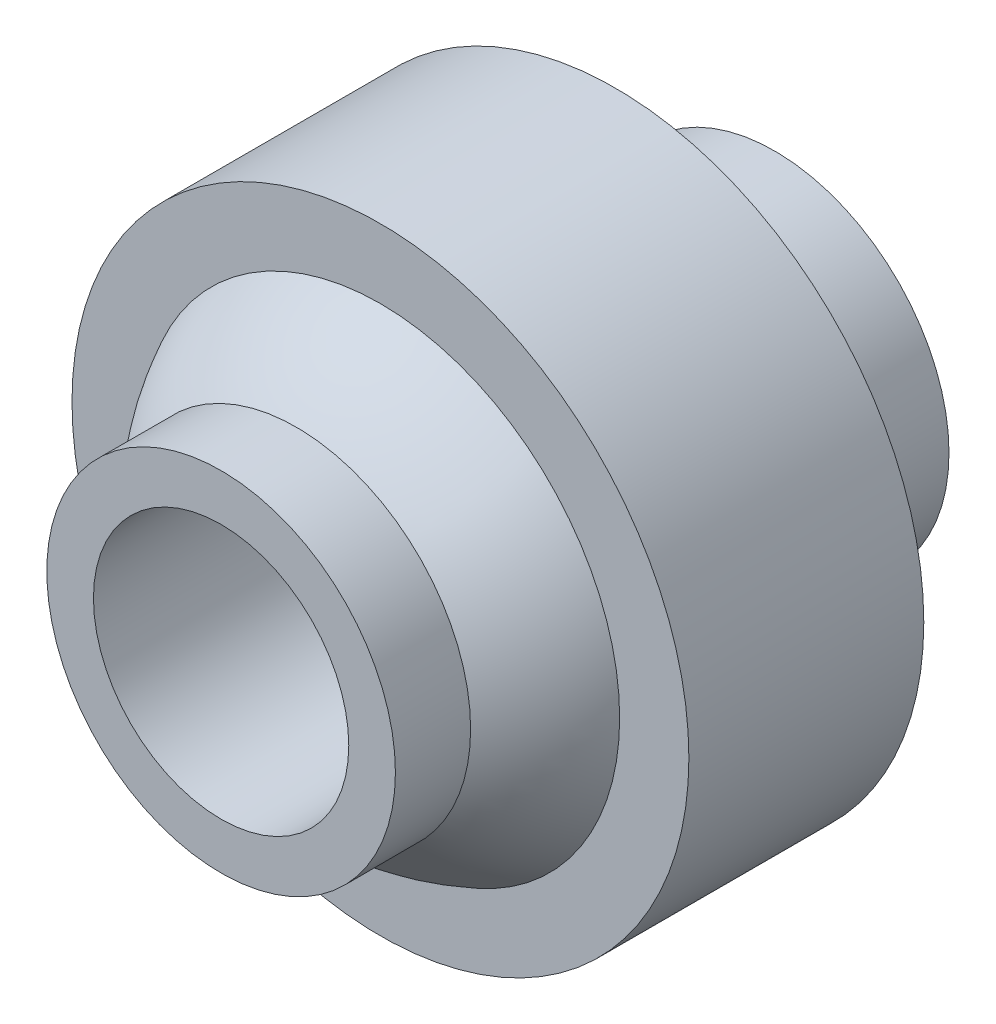
ISO-10303-21;
HEADER;
FILE_DESCRIPTION(('STEP AP214'),'2;1');
FILE_NAME('part.step','',(''),(''),'','','');
FILE_SCHEMA(('AUTOMOTIVE_DESIGN { 1 0 10303 214 1 1 1 1 }'));
ENDSEC;
DATA;
#1=APPLICATION_CONTEXT('core data for automotive mechanical design processes');
#2=APPLICATION_PROTOCOL_DEFINITION('international standard','automotive_design',2000,#1);
#3=PRODUCT_CONTEXT('',#1,'mechanical');
#4=PRODUCT('Part','Part','',(#3));
#5=PRODUCT_RELATED_PRODUCT_CATEGORY('part','',(#4));
#6=PRODUCT_DEFINITION_FORMATION('','',#4);
#7=PRODUCT_DEFINITION_CONTEXT('part definition',#1,'design');
#8=PRODUCT_DEFINITION('design','',#6,#7);
#9=PRODUCT_DEFINITION_SHAPE('','',#8);
#10=(LENGTH_UNIT() NAMED_UNIT(*) SI_UNIT(.MILLI.,.METRE.));
#11=(NAMED_UNIT(*) PLANE_ANGLE_UNIT() SI_UNIT($,.RADIAN.));
#12=(NAMED_UNIT(*) SI_UNIT($,.STERADIAN.) SOLID_ANGLE_UNIT());
#13=UNCERTAINTY_MEASURE_WITH_UNIT(LENGTH_MEASURE(1.E-05),#10,'distance_accuracy_value','');
#14=(GEOMETRIC_REPRESENTATION_CONTEXT(3) GLOBAL_UNCERTAINTY_ASSIGNED_CONTEXT((#13)) GLOBAL_UNIT_ASSIGNED_CONTEXT((#10,
#11,#12)) REPRESENTATION_CONTEXT('',''));
#15=CARTESIAN_POINT('',(0.,0.,0.));
#16=DIRECTION('',(0.,0.,1.));
#17=DIRECTION('',(1.,0.,0.));
#18=AXIS2_PLACEMENT_3D('',#15,#16,#17);
#19=CARTESIAN_POINT('',(0.,-4.7625,10.3251));
#20=DIRECTION('',(0.,0.,1.));
#21=DIRECTION('',(1.,0.,0.));
#22=AXIS2_PLACEMENT_3D('',#19,#20,#21);
#23=PLANE('',#22);
#24=CARTESIAN_POINT('',(0.,0.,10.3251));
#25=DIRECTION('',(0.,0.,1.));
#26=DIRECTION('',(1.,0.,0.));
#27=AXIS2_PLACEMENT_3D('',#24,#25,#26);
#28=CIRCLE('',#27,6.5024);
#29=CARTESIAN_POINT('',(6.5024,0.,10.3251));
#30=VERTEX_POINT('',#29);
#31=EDGE_CURVE('E11',#30,#30,#28,.T.);
#32=ORIENTED_EDGE('',*,*,#31,.T.);
#33=EDGE_LOOP('',(#32));
#34=FACE_BOUND('',#33,.T.);
#35=CARTESIAN_POINT('',(0.,0.,10.3251));
#36=DIRECTION('',(0.,0.,1.));
#37=DIRECTION('',(1.,0.,0.));
#38=AXIS2_PLACEMENT_3D('',#35,#36,#37);
#39=CIRCLE('',#38,4.7625);
#40=CARTESIAN_POINT('',(4.7625,0.,10.3251));
#41=VERTEX_POINT('',#40);
#42=EDGE_CURVE('E95',#41,#41,#39,.T.);
#43=ORIENTED_EDGE('',*,*,#42,.F.);
#44=EDGE_LOOP('',(#43));
#45=FACE_BOUND('',#44,.T.);
#46=ADVANCED_FACE('F46',(#34,#45),#23,.T.);
#47=CARTESIAN_POINT('',(0.,0.,0.));
#48=DIRECTION('',(0.,0.,1.));
#49=DIRECTION('',(1.,0.,0.));
#50=AXIS2_PLACEMENT_3D('',#47,#48,#49);
#51=CYLINDRICAL_SURFACE('',#50,6.5024);
#52=CARTESIAN_POINT('',(0.,0.,7.51999303852258));
#53=DIRECTION('',(0.,0.,1.));
#54=DIRECTION('',(1.,0.,0.));
#55=AXIS2_PLACEMENT_3D('',#52,#53,#54);
#56=CIRCLE('',#55,6.5024);
#57=CARTESIAN_POINT('',(0.,-6.5024,7.51999303852258));
#58=VERTEX_POINT('',#57);
#59=EDGE_CURVE('E54',#58,#58,#56,.T.);
#60=ORIENTED_EDGE('',*,*,#59,.T.);
#61=EDGE_LOOP('',(#60));
#62=FACE_BOUND('',#61,.T.);
#63=ORIENTED_EDGE('',*,*,#31,.F.);
#64=EDGE_LOOP('',(#63));
#65=FACE_BOUND('',#64,.T.);
#66=ADVANCED_FACE('F103',(#62,#65),#51,.T.);
#67=CARTESIAN_POINT('',(0.,0.,0.));
#68=DIRECTION('',(0.,0.,1.));
#69=DIRECTION('',(0.,-1.,0.));
#70=AXIS2_PLACEMENT_3D('',#67,#68,#69);
#71=SPHERICAL_SURFACE('',#70,9.94140337474685);
#72=CARTESIAN_POINT('',(0.,0.,4.3815));
#73=DIRECTION('',(0.,0.,1.));
#74=DIRECTION('',(1.,0.,0.));
#75=AXIS2_PLACEMENT_3D('',#72,#73,#74);
#76=CIRCLE('',#75,8.92378612526253);
#77=CARTESIAN_POINT('',(0.,-8.92378612526253,4.3815));
#78=VERTEX_POINT('',#77);
#79=EDGE_CURVE('E60',#78,#78,#76,.T.);
#80=CARTESIAN_POINT('',(0.,-8.92378612526253,4.3815));
#81=CARTESIAN_POINT('',(0.,-8.90546481729422,4.41881497896161));
#82=CARTESIAN_POINT('',(0.,-8.88690943364751,4.45601502848034));
#83=CARTESIAN_POINT('',(0.,-8.8493334926746,4.5301794439424));
#84=CARTESIAN_POINT('',(0.,-8.83031293534842,4.56714380988573));
#85=CARTESIAN_POINT('',(0.,-8.79180962469392,4.64083103350731));
#86=CARTESIAN_POINT('',(0.,-8.77232687136561,4.67755389118557));
#87=CARTESIAN_POINT('',(0.,-8.73290223873137,4.75075232152972));
#88=CARTESIAN_POINT('',(0.,-8.71296035942545,4.78722789419562));
#89=CARTESIAN_POINT('',(0.,-8.67262061185469,4.85992601401866));
#90=CARTESIAN_POINT('',(0.,-8.65222274358986,4.8961485611758));
#91=CARTESIAN_POINT('',(0.,-8.61097422828435,4.96833493001549));
#92=CARTESIAN_POINT('',(0.,-8.59012358124367,5.00429875169802));
#93=CARTESIAN_POINT('',(0.,-8.54797278944319,5.07596201014548));
#94=CARTESIAN_POINT('',(0.,-8.52667264468339,5.1116614469104));
#95=CARTESIAN_POINT('',(0.,-8.48362620933714,5.18279031773544));
#96=CARTESIAN_POINT('',(0.,-8.46187991875069,5.21821975179556));
#97=CARTESIAN_POINT('',(0.,-8.41794461382371,5.28880304189874));
#98=CARTESIAN_POINT('',(0.,-8.39575559948319,5.3239568979418));
#99=CARTESIAN_POINT('',(0.,-8.35093833879657,5.39398350006827));
#100=CARTESIAN_POINT('',(0.,-8.32831009245048,5.42885624615169));
#101=CARTESIAN_POINT('',(0.,-8.28261792861852,5.49831514065181));
#102=CARTESIAN_POINT('',(0.,-8.25955401113264,5.53290128906852));
#103=CARTESIAN_POINT('',(0.,-8.21299413444624,5.60178154562856));
#104=CARTESIAN_POINT('',(0.,-8.18949817524573,5.63607565377188));
#105=CARTESIAN_POINT('',(0.,-8.14207791254278,5.70436643313491));
#106=CARTESIAN_POINT('',(0.,-8.11815360904034,5.73836310435463));
#107=CARTESIAN_POINT('',(0.,-8.06988042255219,5.80605366002607));
#108=CARTESIAN_POINT('',(0.,-8.04553153956648,5.83974754447779));
#109=CARTESIAN_POINT('',(0.,-7.99641302574381,5.9068272244165));
#110=CARTESIAN_POINT('',(0.,-7.97164339490686,5.9402130199035));
#111=CARTESIAN_POINT('',(0.,-7.92168728322426,6.00667126819807));
#112=CARTESIAN_POINT('',(0.,-7.89650080237861,6.03974372100565));
#113=CARTESIAN_POINT('',(0.,-7.84571495411821,6.1055700795355));
#114=CARTESIAN_POINT('',(0.,-7.82011558670347,6.13832398525776));
#115=CARTESIAN_POINT('',(0.,-7.76850799371789,6.20350809533884));
#116=CARTESIAN_POINT('',(0.,-7.74249976814705,6.23593829969766));
#117=CARTESIAN_POINT('',(0.,-7.69007855160175,6.30046990371258));
#118=CARTESIAN_POINT('',(0.,-7.66366556062728,6.33257130336868));
#119=CARTESIAN_POINT('',(0.,-7.6104389697226,6.39644024638086));
#120=CARTESIAN_POINT('',(0.,-7.58362536979238,6.42820778973694));
#121=CARTESIAN_POINT('',(0.,-7.52960178046539,6.49140402108863));
#122=CARTESIAN_POINT('',(0.,-7.50239179106862,6.52283270908424));
#123=CARTESIAN_POINT('',(0.,-7.4475797046751,6.58534628397816));
#124=CARTESIAN_POINT('',(0.,-7.41997760767835,6.61643117087646));
#125=CARTESIAN_POINT('',(0.,-7.36438564965487,6.67825225194063));
#126=CARTESIAN_POINT('',(0.,-7.33639578862814,6.7089884461065));
#127=CARTESIAN_POINT('',(0.,-7.2800327071351,6.7701073049427));
#128=CARTESIAN_POINT('',(0.,-7.25165948666879,6.80048996961304));
#129=CARTESIAN_POINT('',(0.,-7.19453415121242,6.86089698832622));
#130=CARTESIAN_POINT('',(0.,-7.16578203622236,6.89092134236905));
#131=CARTESIAN_POINT('',(0.,-7.10790343626401,6.95060701508642));
#132=CARTESIAN_POINT('',(0.,-7.07877695129571,6.98026833376096));
#133=CARTESIAN_POINT('',(0.,-7.02015419481851,7.03922326810686));
#134=CARTESIAN_POINT('',(0.,-6.99065792330961,7.06851688377822));
#135=CARTESIAN_POINT('',(0.,-6.93130023545503,7.12673180243079));
#136=CARTESIAN_POINT('',(0.,-6.90143881910936,7.15565310541201));
#137=CARTESIAN_POINT('',(0.,-6.84135554046498,7.21311884726939));
#138=CARTESIAN_POINT('',(0.,-6.81113367816628,7.24166328614556));
#139=CARTESIAN_POINT('',(0.,-6.75033426426818,7.29837080886381));
#140=CARTESIAN_POINT('',(0.,-6.71975671266878,7.32653389270588));
#141=CARTESIAN_POINT('',(0.,-6.65825072888505,7.3824742700304));
#142=CARTESIAN_POINT('',(0.,-6.62732229670071,7.41025156351284));
#143=CARTESIAN_POINT('',(0.,-6.56511943026807,7.46541600195276));
#144=CARTESIAN_POINT('',(0.,-6.53384499601978,7.49280314691024));
#145=CARTESIAN_POINT('',(0.,-6.5024,7.51999303852258));
#146=B_SPLINE_CURVE_WITH_KNOTS('',3,(#80,#81,#82,#83,#84,#85,#86,#87,#88,#89,#90,#91,#92,#93,
#94,#95,#96,#97,#98,#99,#100,#101,#102,#103,#104,#105,#106,#107,#108,#109,#110,#111,#112,#113,
#114,#115,#116,#117,#118,#119,#120,#121,#122,#123,#124,#125,#126,#127,#128,#129,#130,#131,#132,
#133,#134,#135,#136,#137,#138,#139,#140,#141,#142,#143,#144,#145),.UNSPECIFIED.,.F.,.F.,(4,2,2,
2,2,2,2,2,2,2,2,2,2,2,2,2,2,2,2,2,2,2,2,2,2,2,2,2,2,2,2,2,4),(0.,0.124709653743759,
0.249419307487516,0.374128961231273,0.49883861497503,0.623548268718787,0.748257922462545,
0.872967576206303,0.997677229950059,1.12238688369382,1.24709653743757,1.37180619118133,
1.49651584492509,1.62122549866885,1.7459351524126,1.87064480615636,1.99535445990012,
2.12006411364388,2.24477376738763,2.36948342113139,2.49419307487515,2.6189027286189,
2.74361238236266,2.86832203610642,2.99303168985018,3.11774134359393,3.24245099733769,
3.36716065108145,3.49187030482521,3.61657995856896,3.74128961231272,3.86599926605648,
3.99070891980024),.UNSPECIFIED.);
#147=EDGE_CURVE('BSEAM107',#78,#58,#146,.T.);
#148=ORIENTED_EDGE('',*,*,#79,.T.);
#149=ORIENTED_EDGE('',*,*,#59,.F.);
#150=ORIENTED_EDGE('',*,*,#147,.T.);
#151=ORIENTED_EDGE('',*,*,#147,.F.);
#152=EDGE_LOOP('',(#148,#150,#149,#151));
#153=FACE_BOUND('',#152,.T.);
#154=ADVANCED_FACE('F107',(#153),#71,.T.);
#155=CARTESIAN_POINT('',(0.,-8.92378612526253,4.3815));
#156=DIRECTION('',(0.,0.,1.));
#157=DIRECTION('',(1.,0.,0.));
#158=AXIS2_PLACEMENT_3D('',#155,#156,#157);
#159=PLANE('',#158);
#160=CARTESIAN_POINT('',(0.,0.,4.3815));
#161=DIRECTION('',(0.,0.,1.));
#162=DIRECTION('',(1.,0.,0.));
#163=AXIS2_PLACEMENT_3D('',#160,#161,#162);
#164=CIRCLE('',#163,11.5062);
#165=CARTESIAN_POINT('',(11.5062,0.,4.3815));
#166=VERTEX_POINT('',#165);
#167=EDGE_CURVE('E65',#166,#166,#164,.T.);
#168=ORIENTED_EDGE('',*,*,#167,.T.);
#169=EDGE_LOOP('',(#168));
#170=FACE_BOUND('',#169,.T.);
#171=ORIENTED_EDGE('',*,*,#79,.F.);
#172=EDGE_LOOP('',(#171));
#173=FACE_BOUND('',#172,.T.);
#174=ADVANCED_FACE('F111',(#170,#173),#159,.T.);
#175=CARTESIAN_POINT('',(0.,0.,0.));
#176=DIRECTION('',(0.,0.,1.));
#177=DIRECTION('',(1.,0.,0.));
#178=AXIS2_PLACEMENT_3D('',#175,#176,#177);
#179=CYLINDRICAL_SURFACE('',#178,11.5062);
#180=CARTESIAN_POINT('',(0.,0.,-4.3815));
#181=DIRECTION('',(0.,0.,1.));
#182=DIRECTION('',(1.,0.,0.));
#183=AXIS2_PLACEMENT_3D('',#180,#181,#182);
#184=CIRCLE('',#183,11.5062);
#185=CARTESIAN_POINT('',(11.5062,0.,-4.3815));
#186=VERTEX_POINT('',#185);
#187=EDGE_CURVE('E76',#186,#186,#184,.T.);
#188=ORIENTED_EDGE('',*,*,#187,.T.);
#189=EDGE_LOOP('',(#188));
#190=FACE_BOUND('',#189,.T.);
#191=ORIENTED_EDGE('',*,*,#167,.F.);
#192=EDGE_LOOP('',(#191));
#193=FACE_BOUND('',#192,.T.);
#194=ADVANCED_FACE('F118',(#190,#193),#179,.T.);
#195=CARTESIAN_POINT('',(0.,-11.5062,-4.3815));
#196=DIRECTION('',(0.,0.,-1.));
#197=DIRECTION('',(-1.,0.,0.));
#198=AXIS2_PLACEMENT_3D('',#195,#196,#197);
#199=PLANE('',#198);
#200=CARTESIAN_POINT('',(0.,0.,-4.3815));
#201=DIRECTION('',(0.,0.,1.));
#202=DIRECTION('',(1.,0.,0.));
#203=AXIS2_PLACEMENT_3D('',#200,#201,#202);
#204=CIRCLE('',#203,8.92378612526253);
#205=CARTESIAN_POINT('',(0.,-8.92378612526253,-4.3815));
#206=VERTEX_POINT('',#205);
#207=EDGE_CURVE('E80',#206,#206,#204,.T.);
#208=ORIENTED_EDGE('',*,*,#207,.T.);
#209=EDGE_LOOP('',(#208));
#210=FACE_BOUND('',#209,.T.);
#211=ORIENTED_EDGE('',*,*,#187,.F.);
#212=EDGE_LOOP('',(#211));
#213=FACE_BOUND('',#212,.T.);
#214=ADVANCED_FACE('F122',(#210,#213),#199,.T.);
#215=CARTESIAN_POINT('',(0.,0.,0.));
#216=DIRECTION('',(0.,0.,1.));
#217=DIRECTION('',(0.,-1.,0.));
#218=AXIS2_PLACEMENT_3D('',#215,#216,#217);
#219=SPHERICAL_SURFACE('',#218,9.94140337474685);
#220=CARTESIAN_POINT('',(0.,0.,-7.51999303852258));
#221=DIRECTION('',(0.,0.,1.));
#222=DIRECTION('',(1.,0.,0.));
#223=AXIS2_PLACEMENT_3D('',#220,#221,#222);
#224=CIRCLE('',#223,6.5024);
#225=CARTESIAN_POINT('',(0.,-6.5024,-7.51999303852258));
#226=VERTEX_POINT('',#225);
#227=EDGE_CURVE('E85',#226,#226,#224,.T.);
#228=CARTESIAN_POINT('',(0.,-6.5024,-7.51999303852258));
#229=CARTESIAN_POINT('',(0.,-6.53384499601978,-7.49280314691024));
#230=CARTESIAN_POINT('',(0.,-6.56511943026807,-7.46541600195276));
#231=CARTESIAN_POINT('',(0.,-6.62732229670071,-7.41025156351284));
#232=CARTESIAN_POINT('',(0.,-6.65825072888505,-7.3824742700304));
#233=CARTESIAN_POINT('',(0.,-6.71975671266878,-7.32653389270588));
#234=CARTESIAN_POINT('',(0.,-6.75033426426818,-7.29837080886381));
#235=CARTESIAN_POINT('',(0.,-6.81113367816628,-7.24166328614556));
#236=CARTESIAN_POINT('',(0.,-6.84135554046498,-7.21311884726939));
#237=CARTESIAN_POINT('',(0.,-6.90143881910936,-7.15565310541201));
#238=CARTESIAN_POINT('',(0.,-6.93130023545503,-7.12673180243079));
#239=CARTESIAN_POINT('',(0.,-6.99065792330961,-7.06851688377822));
#240=CARTESIAN_POINT('',(0.,-7.02015419481851,-7.03922326810686));
#241=CARTESIAN_POINT('',(0.,-7.07877695129571,-6.98026833376096));
#242=CARTESIAN_POINT('',(0.,-7.10790343626401,-6.95060701508642));
#243=CARTESIAN_POINT('',(0.,-7.16578203622236,-6.89092134236905));
#244=CARTESIAN_POINT('',(0.,-7.19453415121242,-6.86089698832622));
#245=CARTESIAN_POINT('',(0.,-7.25165948666878,-6.80048996961304));
#246=CARTESIAN_POINT('',(0.,-7.2800327071351,-6.7701073049427));
#247=CARTESIAN_POINT('',(0.,-7.33639578862814,-6.7089884461065));
#248=CARTESIAN_POINT('',(0.,-7.36438564965487,-6.67825225194063));
#249=CARTESIAN_POINT('',(0.,-7.41997760767835,-6.61643117087646));
#250=CARTESIAN_POINT('',(0.,-7.4475797046751,-6.58534628397816));
#251=CARTESIAN_POINT('',(0.,-7.50239179106862,-6.52283270908424));
#252=CARTESIAN_POINT('',(0.,-7.52960178046539,-6.49140402108863));
#253=CARTESIAN_POINT('',(0.,-7.58362536979238,-6.42820778973694));
#254=CARTESIAN_POINT('',(0.,-7.6104389697226,-6.39644024638086));
#255=CARTESIAN_POINT('',(0.,-7.66366556062728,-6.33257130336868));
#256=CARTESIAN_POINT('',(0.,-7.69007855160175,-6.30046990371258));
#257=CARTESIAN_POINT('',(0.,-7.74249976814705,-6.23593829969766));
#258=CARTESIAN_POINT('',(0.,-7.76850799371789,-6.20350809533884));
#259=CARTESIAN_POINT('',(0.,-7.82011558670347,-6.13832398525776));
#260=CARTESIAN_POINT('',(0.,-7.84571495411821,-6.1055700795355));
#261=CARTESIAN_POINT('',(0.,-7.89650080237861,-6.03974372100565));
#262=CARTESIAN_POINT('',(0.,-7.92168728322426,-6.00667126819808));
#263=CARTESIAN_POINT('',(0.,-7.97164339490686,-5.9402130199035));
#264=CARTESIAN_POINT('',(0.,-7.99641302574381,-5.9068272244165));
#265=CARTESIAN_POINT('',(0.,-8.04553153956647,-5.83974754447779));
#266=CARTESIAN_POINT('',(0.,-8.06988042255219,-5.80605366002607));
#267=CARTESIAN_POINT('',(0.,-8.11815360904034,-5.73836310435463));
#268=CARTESIAN_POINT('',(0.,-8.14207791254278,-5.70436643313492));
#269=CARTESIAN_POINT('',(0.,-8.18949817524573,-5.63607565377188));
#270=CARTESIAN_POINT('',(0.,-8.21299413444624,-5.60178154562856));
#271=CARTESIAN_POINT('',(0.,-8.25955401113264,-5.53290128906853));
#272=CARTESIAN_POINT('',(0.,-8.28261792861851,-5.49831514065181));
#273=CARTESIAN_POINT('',(0.,-8.32831009245048,-5.42885624615169));
#274=CARTESIAN_POINT('',(0.,-8.35093833879657,-5.39398350006827));
#275=CARTESIAN_POINT('',(0.,-8.39575559948318,-5.3239568979418));
#276=CARTESIAN_POINT('',(0.,-8.41794461382371,-5.28880304189874));
#277=CARTESIAN_POINT('',(0.,-8.46187991875069,-5.21821975179556));
#278=CARTESIAN_POINT('',(0.,-8.48362620933714,-5.18279031773544));
#279=CARTESIAN_POINT('',(0.,-8.52667264468339,-5.1116614469104));
#280=CARTESIAN_POINT('',(0.,-8.54797278944319,-5.07596201014548));
#281=CARTESIAN_POINT('',(0.,-8.59012358124367,-5.00429875169803));
#282=CARTESIAN_POINT('',(0.,-8.61097422828434,-4.96833493001549));
#283=CARTESIAN_POINT('',(0.,-8.65222274358986,-4.89614856117581));
#284=CARTESIAN_POINT('',(0.,-8.67262061185469,-4.85992601401867));
#285=CARTESIAN_POINT('',(0.,-8.71296035942545,-4.78722789419562));
#286=CARTESIAN_POINT('',(0.,-8.73290223873136,-4.75075232152973));
#287=CARTESIAN_POINT('',(0.,-8.7723268713656,-4.67755389118557));
#288=CARTESIAN_POINT('',(0.,-8.79180962469392,-4.64083103350731));
#289=CARTESIAN_POINT('',(0.,-8.83031293534842,-4.56714380988573));
#290=CARTESIAN_POINT('',(0.,-8.84933349267461,-4.5301794439424));
#291=CARTESIAN_POINT('',(0.,-8.8869094336475,-4.45601502848034));
#292=CARTESIAN_POINT('',(0.,-8.90546481729422,-4.41881497896161));
#293=CARTESIAN_POINT('',(0.,-8.92378612526253,-4.3815));
#294=B_SPLINE_CURVE_WITH_KNOTS('',3,(#228,#229,#230,#231,#232,#233,#234,#235,#236,#237,#238,
#239,#240,#241,#242,#243,#244,#245,#246,#247,#248,#249,#250,#251,#252,#253,#254,#255,#256,#257,
#258,#259,#260,#261,#262,#263,#264,#265,#266,#267,#268,#269,#270,#271,#272,#273,#274,#275,#276,
#277,#278,#279,#280,#281,#282,#283,#284,#285,#286,#287,#288,#289,#290,#291,#292,#293),
.UNSPECIFIED.,.F.,.F.,(4,2,2,2,2,2,2,2,2,2,2,2,2,2,2,2,2,2,2,2,2,2,2,2,2,2,2,2,2,2,2,2,4),(0.,
0.124709653743758,0.249419307487515,0.374128961231271,0.498838614975028,0.623548268718787,
0.748257922462543,0.8729675762063,0.997677229950057,1.12238688369381,1.24709653743757,
1.37180619118133,1.49651584492509,1.62122549866884,1.7459351524126,1.87064480615636,
1.99535445990012,2.12006411364387,2.24477376738763,2.36948342113139,2.49419307487514,
2.6189027286189,2.74361238236266,2.86832203610642,2.99303168985017,3.11774134359393,
3.24245099733769,3.36716065108144,3.4918703048252,3.61657995856896,3.74128961231272,
3.86599926605647,3.99070891980023),.UNSPECIFIED.);
#295=EDGE_CURVE('BSEAM126',#226,#206,#294,.T.);
#296=ORIENTED_EDGE('',*,*,#227,.T.);
#297=ORIENTED_EDGE('',*,*,#207,.F.);
#298=ORIENTED_EDGE('',*,*,#295,.T.);
#299=ORIENTED_EDGE('',*,*,#295,.F.);
#300=EDGE_LOOP('',(#296,#298,#297,#299));
#301=FACE_BOUND('',#300,.T.);
#302=ADVANCED_FACE('F126',(#301),#219,.T.);
#303=CARTESIAN_POINT('',(0.,0.,0.));
#304=DIRECTION('',(0.,0.,1.));
#305=DIRECTION('',(1.,0.,0.));
#306=AXIS2_PLACEMENT_3D('',#303,#304,#305);
#307=CYLINDRICAL_SURFACE('',#306,6.5024);
#308=CARTESIAN_POINT('',(0.,0.,-10.3251));
#309=DIRECTION('',(0.,0.,1.));
#310=DIRECTION('',(1.,0.,0.));
#311=AXIS2_PLACEMENT_3D('',#308,#309,#310);
#312=CIRCLE('',#311,6.5024);
#313=CARTESIAN_POINT('',(6.5024,0.,-10.3251));
#314=VERTEX_POINT('',#313);
#315=EDGE_CURVE('E89',#314,#314,#312,.T.);
#316=ORIENTED_EDGE('',*,*,#315,.T.);
#317=EDGE_LOOP('',(#316));
#318=FACE_BOUND('',#317,.T.);
#319=ORIENTED_EDGE('',*,*,#227,.F.);
#320=EDGE_LOOP('',(#319));
#321=FACE_BOUND('',#320,.T.);
#322=ADVANCED_FACE('F130',(#318,#321),#307,.T.);
#323=CARTESIAN_POINT('',(0.,-4.7625,-10.3251));
#324=DIRECTION('',(0.,0.,-1.));
#325=DIRECTION('',(-1.,0.,0.));
#326=AXIS2_PLACEMENT_3D('',#323,#324,#325);
#327=PLANE('',#326);
#328=CARTESIAN_POINT('',(0.,0.,-10.3251));
#329=DIRECTION('',(0.,0.,1.));
#330=DIRECTION('',(1.,0.,0.));
#331=AXIS2_PLACEMENT_3D('',#328,#329,#330);
#332=CIRCLE('',#331,4.7625);
#333=CARTESIAN_POINT('',(4.7625,0.,-10.3251));
#334=VERTEX_POINT('',#333);
#335=EDGE_CURVE('E92',#334,#334,#332,.T.);
#336=ORIENTED_EDGE('',*,*,#335,.T.);
#337=EDGE_LOOP('',(#336));
#338=FACE_BOUND('',#337,.T.);
#339=ORIENTED_EDGE('',*,*,#315,.F.);
#340=EDGE_LOOP('',(#339));
#341=FACE_BOUND('',#340,.T.);
#342=ADVANCED_FACE('F134',(#338,#341),#327,.T.);
#343=CARTESIAN_POINT('',(0.,0.,0.));
#344=DIRECTION('',(0.,0.,1.));
#345=DIRECTION('',(1.,0.,0.));
#346=AXIS2_PLACEMENT_3D('',#343,#344,#345);
#347=CYLINDRICAL_SURFACE('',#346,4.7625);
#348=ORIENTED_EDGE('',*,*,#42,.T.);
#349=EDGE_LOOP('',(#348));
#350=FACE_BOUND('',#349,.T.);
#351=ORIENTED_EDGE('',*,*,#335,.F.);
#352=EDGE_LOOP('',(#351));
#353=FACE_BOUND('',#352,.T.);
#354=ADVANCED_FACE('F99',(#350,#353),#347,.F.);
#355=CLOSED_SHELL('',(#46,#66,#154,#174,#194,#214,#302,#322,#342,#354));
#356=MANIFOLD_SOLID_BREP('B2',#355);
#357=ADVANCED_BREP_SHAPE_REPRESENTATION('',(#18,#356),#14);
#358=SHAPE_DEFINITION_REPRESENTATION(#9,#357);
ENDSEC;
END-ISO-10303-21;
